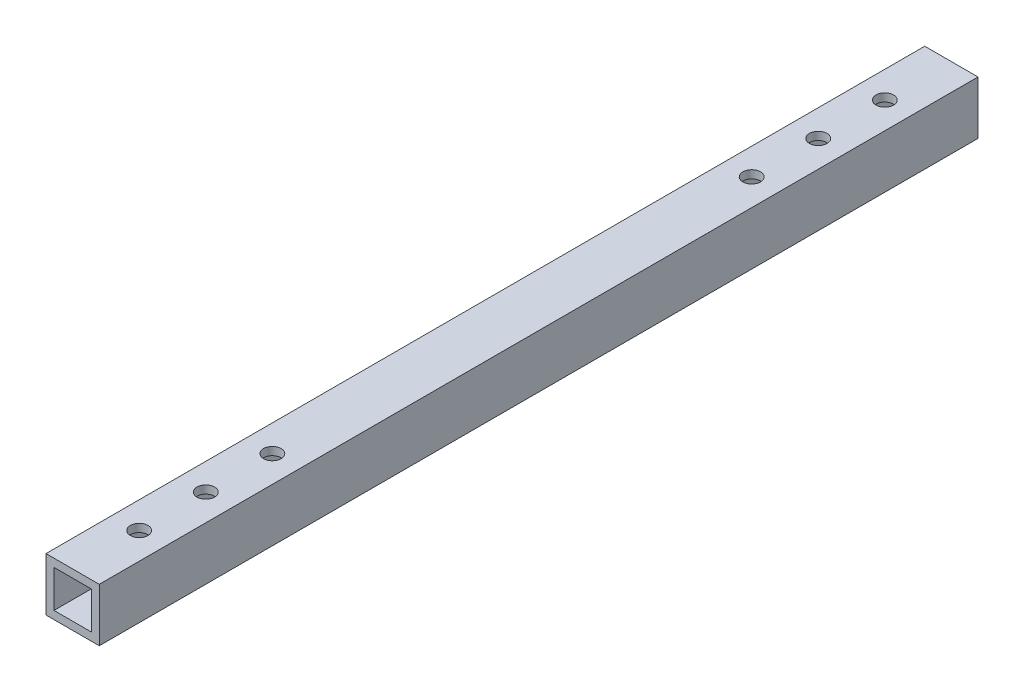
ISO-10303-21;
HEADER;
FILE_DESCRIPTION(('STEP AP214'),'2;1');
FILE_NAME('part.step','',(''),(''),'','','');
FILE_SCHEMA(('AUTOMOTIVE_DESIGN { 1 0 10303 214 1 1 1 1 }'));
ENDSEC;
DATA;
#1=APPLICATION_CONTEXT('core data for automotive mechanical design processes');
#2=APPLICATION_PROTOCOL_DEFINITION('international standard','automotive_design',2000,#1);
#3=PRODUCT_CONTEXT('',#1,'mechanical');
#4=PRODUCT('Part','Part','',(#3));
#5=PRODUCT_RELATED_PRODUCT_CATEGORY('part','',(#4));
#6=PRODUCT_DEFINITION_FORMATION('','',#4);
#7=PRODUCT_DEFINITION_CONTEXT('part definition',#1,'design');
#8=PRODUCT_DEFINITION('design','',#6,#7);
#9=PRODUCT_DEFINITION_SHAPE('','',#8);
#10=(LENGTH_UNIT() NAMED_UNIT(*) SI_UNIT(.MILLI.,.METRE.));
#11=(NAMED_UNIT(*) PLANE_ANGLE_UNIT() SI_UNIT($,.RADIAN.));
#12=(NAMED_UNIT(*) SI_UNIT($,.STERADIAN.) SOLID_ANGLE_UNIT());
#13=UNCERTAINTY_MEASURE_WITH_UNIT(LENGTH_MEASURE(1.E-05),#10,'distance_accuracy_value','');
#14=(GEOMETRIC_REPRESENTATION_CONTEXT(3) GLOBAL_UNCERTAINTY_ASSIGNED_CONTEXT((#13)) GLOBAL_UNIT_ASSIGNED_CONTEXT((#10,
#11,#12)) REPRESENTATION_CONTEXT('',''));
#15=CARTESIAN_POINT('',(0.,0.,0.));
#16=DIRECTION('',(0.,0.,1.));
#17=DIRECTION('',(1.,0.,0.));
#18=AXIS2_PLACEMENT_3D('',#15,#16,#17);
#19=CARTESIAN_POINT('',(0.,0.,165.));
#20=DIRECTION('',(0.,0.,1.));
#21=DIRECTION('',(1.,0.,0.));
#22=AXIS2_PLACEMENT_3D('',#19,#20,#21);
#23=PLANE('',#22);
#24=DIRECTION('',(0.,1.,0.));
#25=VECTOR('',#24,1.);
#26=CARTESIAN_POINT('',(5.,5.,165.));
#27=LINE('',#26,#25);
#28=CARTESIAN_POINT('',(5.,-5.,165.));
#29=VERTEX_POINT('',#28);
#30=CARTESIAN_POINT('',(5.,5.,165.));
#31=VERTEX_POINT('',#30);
#32=EDGE_CURVE('E140',#29,#31,#27,.T.);
#33=ORIENTED_EDGE('',*,*,#32,.T.);
#34=DIRECTION('',(-1.,0.,0.));
#35=VECTOR('',#34,1.);
#36=CARTESIAN_POINT('',(-5.,5.,165.));
#37=LINE('',#36,#35);
#38=CARTESIAN_POINT('',(-5.,5.,165.));
#39=VERTEX_POINT('',#38);
#40=EDGE_CURVE('E143',#31,#39,#37,.T.);
#41=ORIENTED_EDGE('',*,*,#40,.T.);
#42=DIRECTION('',(0.,-1.,0.));
#43=VECTOR('',#42,1.);
#44=CARTESIAN_POINT('',(-5.,5.,165.));
#45=LINE('',#44,#43);
#46=CARTESIAN_POINT('',(-5.,-5.,165.));
#47=VERTEX_POINT('',#46);
#48=EDGE_CURVE('E146',#39,#47,#45,.T.);
#49=ORIENTED_EDGE('',*,*,#48,.T.);
#50=DIRECTION('',(1.,0.,0.));
#51=VECTOR('',#50,1.);
#52=CARTESIAN_POINT('',(-5.,-5.,165.));
#53=LINE('',#52,#51);
#54=EDGE_CURVE('E148',#47,#29,#53,.T.);
#55=ORIENTED_EDGE('',*,*,#54,.T.);
#56=EDGE_LOOP('',(#33,#41,#49,#55));
#57=FACE_BOUND('',#56,.T.);
#58=DIRECTION('',(-1.,0.,0.));
#59=VECTOR('',#58,1.);
#60=CARTESIAN_POINT('',(-3.5,3.5,165.));
#61=LINE('',#60,#59);
#62=CARTESIAN_POINT('',(3.5,3.5,165.));
#63=VERTEX_POINT('',#62);
#64=CARTESIAN_POINT('',(-3.5,3.5,165.));
#65=VERTEX_POINT('',#64);
#66=EDGE_CURVE('E110',#63,#65,#61,.T.);
#67=ORIENTED_EDGE('',*,*,#66,.F.);
#68=DIRECTION('',(0.,1.,0.));
#69=VECTOR('',#68,1.);
#70=CARTESIAN_POINT('',(3.5,3.5,165.));
#71=LINE('',#70,#69);
#72=CARTESIAN_POINT('',(3.5,-3.5,165.));
#73=VERTEX_POINT('',#72);
#74=EDGE_CURVE('E102',#73,#63,#71,.T.);
#75=ORIENTED_EDGE('',*,*,#74,.F.);
#76=DIRECTION('',(1.,0.,0.));
#77=VECTOR('',#76,1.);
#78=CARTESIAN_POINT('',(-3.5,-3.5,165.));
#79=LINE('',#78,#77);
#80=CARTESIAN_POINT('',(-3.5,-3.5,165.));
#81=VERTEX_POINT('',#80);
#82=EDGE_CURVE('E124',#81,#73,#79,.T.);
#83=ORIENTED_EDGE('',*,*,#82,.F.);
#84=DIRECTION('',(0.,-1.,0.));
#85=VECTOR('',#84,1.);
#86=CARTESIAN_POINT('',(-3.5,3.5,165.));
#87=LINE('',#86,#85);
#88=EDGE_CURVE('E122',#65,#81,#87,.T.);
#89=ORIENTED_EDGE('',*,*,#88,.F.);
#90=EDGE_LOOP('',(#67,#75,#83,#89));
#91=FACE_BOUND('',#90,.T.);
#92=ADVANCED_FACE('F35',(#57,#91),#23,.T.);
#93=CARTESIAN_POINT('',(0.,0.,0.));
#94=DIRECTION('',(0.,0.,1.));
#95=DIRECTION('',(1.,0.,0.));
#96=AXIS2_PLACEMENT_3D('',#93,#94,#95);
#97=PLANE('',#96);
#98=DIRECTION('',(0.,1.,0.));
#99=VECTOR('',#98,1.);
#100=CARTESIAN_POINT('',(5.,5.,0.));
#101=LINE('',#100,#99);
#102=CARTESIAN_POINT('',(5.,-5.,0.));
#103=VERTEX_POINT('',#102);
#104=CARTESIAN_POINT('',(5.,5.,0.));
#105=VERTEX_POINT('',#104);
#106=EDGE_CURVE('E118',#103,#105,#101,.T.);
#107=ORIENTED_EDGE('',*,*,#106,.F.);
#108=DIRECTION('',(1.,0.,0.));
#109=VECTOR('',#108,1.);
#110=CARTESIAN_POINT('',(-5.,-5.,0.));
#111=LINE('',#110,#109);
#112=CARTESIAN_POINT('',(-5.,-5.,0.));
#113=VERTEX_POINT('',#112);
#114=EDGE_CURVE('E144',#113,#103,#111,.T.);
#115=ORIENTED_EDGE('',*,*,#114,.F.);
#116=DIRECTION('',(0.,-1.,0.));
#117=VECTOR('',#116,1.);
#118=CARTESIAN_POINT('',(-5.,5.,0.));
#119=LINE('',#118,#117);
#120=CARTESIAN_POINT('',(-5.,5.,0.));
#121=VERTEX_POINT('',#120);
#122=EDGE_CURVE('E155',#121,#113,#119,.T.);
#123=ORIENTED_EDGE('',*,*,#122,.F.);
#124=DIRECTION('',(-1.,0.,0.));
#125=VECTOR('',#124,1.);
#126=CARTESIAN_POINT('',(-5.,5.,0.));
#127=LINE('',#126,#125);
#128=EDGE_CURVE('E153',#105,#121,#127,.T.);
#129=ORIENTED_EDGE('',*,*,#128,.F.);
#130=EDGE_LOOP('',(#107,#115,#123,#129));
#131=FACE_BOUND('',#130,.T.);
#132=DIRECTION('',(0.,1.,0.));
#133=VECTOR('',#132,1.);
#134=CARTESIAN_POINT('',(3.5,3.5,0.));
#135=LINE('',#134,#133);
#136=CARTESIAN_POINT('',(3.5,-3.5,0.));
#137=VERTEX_POINT('',#136);
#138=CARTESIAN_POINT('',(3.5,3.5,0.));
#139=VERTEX_POINT('',#138);
#140=EDGE_CURVE('E60',#137,#139,#135,.T.);
#141=ORIENTED_EDGE('',*,*,#140,.T.);
#142=DIRECTION('',(-1.,0.,0.));
#143=VECTOR('',#142,1.);
#144=CARTESIAN_POINT('',(-3.5,3.5,0.));
#145=LINE('',#144,#143);
#146=CARTESIAN_POINT('',(-3.5,3.5,0.));
#147=VERTEX_POINT('',#146);
#148=EDGE_CURVE('E117',#139,#147,#145,.T.);
#149=ORIENTED_EDGE('',*,*,#148,.T.);
#150=DIRECTION('',(0.,-1.,0.));
#151=VECTOR('',#150,1.);
#152=CARTESIAN_POINT('',(-3.5,3.5,0.));
#153=LINE('',#152,#151);
#154=CARTESIAN_POINT('',(-3.5,-3.5,0.));
#155=VERTEX_POINT('',#154);
#156=EDGE_CURVE('E132',#147,#155,#153,.T.);
#157=ORIENTED_EDGE('',*,*,#156,.T.);
#158=DIRECTION('',(1.,0.,0.));
#159=VECTOR('',#158,1.);
#160=CARTESIAN_POINT('',(-3.5,-3.5,0.));
#161=LINE('',#160,#159);
#162=EDGE_CURVE('E111',#155,#137,#161,.T.);
#163=ORIENTED_EDGE('',*,*,#162,.T.);
#164=EDGE_LOOP('',(#141,#149,#157,#163));
#165=FACE_BOUND('',#164,.T.);
#166=ADVANCED_FACE('F219',(#131,#165),#97,.F.);
#167=CARTESIAN_POINT('',(5.,5.,165.));
#168=DIRECTION('',(-1.,0.,0.));
#169=DIRECTION('',(0.,0.,1.));
#170=AXIS2_PLACEMENT_3D('',#167,#168,#169);
#171=PLANE('',#170);
#172=ORIENTED_EDGE('',*,*,#106,.T.);
#173=DIRECTION('',(0.,0.,-1.));
#174=VECTOR('',#173,1.);
#175=CARTESIAN_POINT('',(5.,5.,165.));
#176=LINE('',#175,#174);
#177=EDGE_CURVE('E11',#31,#105,#176,.T.);
#178=ORIENTED_EDGE('',*,*,#177,.F.);
#179=ORIENTED_EDGE('',*,*,#32,.F.);
#180=DIRECTION('',(0.,0.,-1.));
#181=VECTOR('',#180,1.);
#182=CARTESIAN_POINT('',(5.,-5.,165.));
#183=LINE('',#182,#181);
#184=EDGE_CURVE('E150',#29,#103,#183,.T.);
#185=ORIENTED_EDGE('',*,*,#184,.T.);
#186=EDGE_LOOP('',(#172,#178,#179,#185));
#187=FACE_BOUND('',#186,.T.);
#188=ADVANCED_FACE('F37',(#187),#171,.F.);
#189=CARTESIAN_POINT('',(-5.,5.,165.));
#190=DIRECTION('',(0.,-1.,0.));
#191=DIRECTION('',(0.,0.,-1.));
#192=AXIS2_PLACEMENT_3D('',#189,#190,#191);
#193=PLANE('',#192);
#194=CARTESIAN_POINT('',(4.12777451108681E-12,5.,12.5000000000034));
#195=DIRECTION('',(0.,1.,0.));
#196=DIRECTION('',(0.,0.,1.));
#197=AXIS2_PLACEMENT_3D('',#194,#195,#196);
#198=CIRCLE('',#197,1.64999999999733);
#199=CARTESIAN_POINT('',(4.12777451108681E-12,5.,14.1500000000007));
#200=VERTEX_POINT('',#199);
#201=EDGE_CURVE('E255',#200,#200,#198,.T.);
#202=ORIENTED_EDGE('',*,*,#201,.F.);
#203=EDGE_LOOP('',(#202));
#204=FACE_BOUND('',#203,.T.);
#205=CARTESIAN_POINT('',(4.12257034065888E-12,5.,25.0000000000034));
#206=DIRECTION('',(0.,1.,0.));
#207=DIRECTION('',(0.,0.,1.));
#208=AXIS2_PLACEMENT_3D('',#205,#206,#207);
#209=CIRCLE('',#208,1.64999999999731);
#210=CARTESIAN_POINT('',(4.12257034065888E-12,5.,26.6500000000007));
#211=VERTEX_POINT('',#210);
#212=EDGE_CURVE('E259',#211,#211,#209,.T.);
#213=ORIENTED_EDGE('',*,*,#212,.F.);
#214=EDGE_LOOP('',(#213));
#215=FACE_BOUND('',#214,.T.);
#216=CARTESIAN_POINT('',(4.12690714934882E-12,5.,37.5000000000034));
#217=DIRECTION('',(0.,1.,0.));
#218=DIRECTION('',(0.,0.,1.));
#219=AXIS2_PLACEMENT_3D('',#216,#217,#218);
#220=CIRCLE('',#219,1.64999999999729);
#221=CARTESIAN_POINT('',(4.12690714934882E-12,5.,39.1500000000007));
#222=VERTEX_POINT('',#221);
#223=EDGE_CURVE('E263',#222,#222,#220,.T.);
#224=ORIENTED_EDGE('',*,*,#223,.F.);
#225=EDGE_LOOP('',(#224));
#226=FACE_BOUND('',#225,.T.);
#227=CARTESIAN_POINT('',(-1.03909936211011E-12,5.,127.5));
#228=DIRECTION('',(0.,1.,0.));
#229=DIRECTION('',(0.,0.,1.));
#230=AXIS2_PLACEMENT_3D('',#227,#228,#229);
#231=CIRCLE('',#230,1.65000000000149);
#232=CARTESIAN_POINT('',(-1.03909936211011E-12,5.,129.150000000001));
#233=VERTEX_POINT('',#232);
#234=EDGE_CURVE('E267',#233,#233,#231,.T.);
#235=ORIENTED_EDGE('',*,*,#234,.F.);
#236=EDGE_LOOP('',(#235));
#237=FACE_BOUND('',#236,.T.);
#238=CARTESIAN_POINT('',(-1.04603825601401E-12,5.,140.));
#239=DIRECTION('',(0.,1.,0.));
#240=DIRECTION('',(0.,0.,1.));
#241=AXIS2_PLACEMENT_3D('',#238,#239,#240);
#242=CIRCLE('',#241,1.65000000000145);
#243=CARTESIAN_POINT('',(-1.04603825601401E-12,5.,141.650000000001));
#244=VERTEX_POINT('',#243);
#245=EDGE_CURVE('E271',#244,#244,#242,.T.);
#246=ORIENTED_EDGE('',*,*,#245,.F.);
#247=EDGE_LOOP('',(#246));
#248=FACE_BOUND('',#247,.T.);
#249=CARTESIAN_POINT('',(-1.05297714991792E-12,5.,152.5));
#250=DIRECTION('',(0.,1.,0.));
#251=DIRECTION('',(0.,0.,1.));
#252=AXIS2_PLACEMENT_3D('',#249,#250,#251);
#253=CIRCLE('',#252,1.6500000000015);
#254=CARTESIAN_POINT('',(-1.05297714991792E-12,5.,154.150000000001));
#255=VERTEX_POINT('',#254);
#256=EDGE_CURVE('E275',#255,#255,#253,.T.);
#257=ORIENTED_EDGE('',*,*,#256,.F.);
#258=EDGE_LOOP('',(#257));
#259=FACE_BOUND('',#258,.T.);
#260=ORIENTED_EDGE('',*,*,#128,.T.);
#261=DIRECTION('',(0.,0.,-1.));
#262=VECTOR('',#261,1.);
#263=CARTESIAN_POINT('',(-5.,5.,165.));
#264=LINE('',#263,#262);
#265=EDGE_CURVE('E44',#39,#121,#264,.T.);
#266=ORIENTED_EDGE('',*,*,#265,.F.);
#267=ORIENTED_EDGE('',*,*,#40,.F.);
#268=ORIENTED_EDGE('',*,*,#177,.T.);
#269=EDGE_LOOP('',(#260,#266,#267,#268));
#270=FACE_BOUND('',#269,.T.);
#271=ADVANCED_FACE('F244',(#204,#215,#226,#237,#248,#259,#270),#193,.F.);
#272=CARTESIAN_POINT('',(-5.,5.,165.));
#273=DIRECTION('',(1.,0.,0.));
#274=DIRECTION('',(0.,0.,-1.));
#275=AXIS2_PLACEMENT_3D('',#272,#273,#274);
#276=PLANE('',#275);
#277=ORIENTED_EDGE('',*,*,#122,.T.);
#278=DIRECTION('',(0.,0.,-1.));
#279=VECTOR('',#278,1.);
#280=CARTESIAN_POINT('',(-5.,-5.,165.));
#281=LINE('',#280,#279);
#282=EDGE_CURVE('E160',#47,#113,#281,.T.);
#283=ORIENTED_EDGE('',*,*,#282,.F.);
#284=ORIENTED_EDGE('',*,*,#48,.F.);
#285=ORIENTED_EDGE('',*,*,#265,.T.);
#286=EDGE_LOOP('',(#277,#283,#284,#285));
#287=FACE_BOUND('',#286,.T.);
#288=ADVANCED_FACE('F241',(#287),#276,.F.);
#289=CARTESIAN_POINT('',(-5.,-5.,165.));
#290=DIRECTION('',(0.,1.,0.));
#291=DIRECTION('',(0.,0.,1.));
#292=AXIS2_PLACEMENT_3D('',#289,#290,#291);
#293=PLANE('',#292);
#294=CARTESIAN_POINT('',(4.12777451108681E-12,-5.,12.5000000000034));
#295=DIRECTION('',(0.,1.,0.));
#296=DIRECTION('',(0.,0.,1.));
#297=AXIS2_PLACEMENT_3D('',#294,#295,#296);
#298=CIRCLE('',#297,1.64999999999733);
#299=CARTESIAN_POINT('',(4.12777451108681E-12,-5.,14.1500000000007));
#300=VERTEX_POINT('',#299);
#301=EDGE_CURVE('E169',#300,#300,#298,.T.);
#302=ORIENTED_EDGE('',*,*,#301,.T.);
#303=EDGE_LOOP('',(#302));
#304=FACE_BOUND('',#303,.T.);
#305=CARTESIAN_POINT('',(4.12257034065888E-12,-5.,25.0000000000034));
#306=DIRECTION('',(0.,1.,0.));
#307=DIRECTION('',(0.,0.,1.));
#308=AXIS2_PLACEMENT_3D('',#305,#306,#307);
#309=CIRCLE('',#308,1.64999999999731);
#310=CARTESIAN_POINT('',(4.12257034065888E-12,-5.,26.6500000000007));
#311=VERTEX_POINT('',#310);
#312=EDGE_CURVE('E352',#311,#311,#309,.T.);
#313=ORIENTED_EDGE('',*,*,#312,.T.);
#314=EDGE_LOOP('',(#313));
#315=FACE_BOUND('',#314,.T.);
#316=CARTESIAN_POINT('',(4.12690714934882E-12,-5.,37.5000000000034));
#317=DIRECTION('',(0.,1.,0.));
#318=DIRECTION('',(0.,0.,1.));
#319=AXIS2_PLACEMENT_3D('',#316,#317,#318);
#320=CIRCLE('',#319,1.64999999999729);
#321=CARTESIAN_POINT('',(4.12690714934882E-12,-5.,39.1500000000007));
#322=VERTEX_POINT('',#321);
#323=EDGE_CURVE('E353',#322,#322,#320,.T.);
#324=ORIENTED_EDGE('',*,*,#323,.T.);
#325=EDGE_LOOP('',(#324));
#326=FACE_BOUND('',#325,.T.);
#327=CARTESIAN_POINT('',(-1.03909936211011E-12,-5.,127.5));
#328=DIRECTION('',(0.,1.,0.));
#329=DIRECTION('',(0.,0.,1.));
#330=AXIS2_PLACEMENT_3D('',#327,#328,#329);
#331=CIRCLE('',#330,1.65000000000149);
#332=CARTESIAN_POINT('',(-1.03909936211011E-12,-5.,129.150000000001));
#333=VERTEX_POINT('',#332);
#334=EDGE_CURVE('E362',#333,#333,#331,.T.);
#335=ORIENTED_EDGE('',*,*,#334,.T.);
#336=EDGE_LOOP('',(#335));
#337=FACE_BOUND('',#336,.T.);
#338=CARTESIAN_POINT('',(-1.04603825601401E-12,-5.,140.));
#339=DIRECTION('',(0.,1.,0.));
#340=DIRECTION('',(0.,0.,1.));
#341=AXIS2_PLACEMENT_3D('',#338,#339,#340);
#342=CIRCLE('',#341,1.65000000000145);
#343=CARTESIAN_POINT('',(-1.04603825601401E-12,-5.,141.650000000001));
#344=VERTEX_POINT('',#343);
#345=EDGE_CURVE('E366',#344,#344,#342,.T.);
#346=ORIENTED_EDGE('',*,*,#345,.T.);
#347=EDGE_LOOP('',(#346));
#348=FACE_BOUND('',#347,.T.);
#349=CARTESIAN_POINT('',(-1.05297714991792E-12,-5.,152.5));
#350=DIRECTION('',(0.,1.,0.));
#351=DIRECTION('',(0.,0.,1.));
#352=AXIS2_PLACEMENT_3D('',#349,#350,#351);
#353=CIRCLE('',#352,1.6500000000015);
#354=CARTESIAN_POINT('',(-1.05297714991792E-12,-5.,154.150000000001));
#355=VERTEX_POINT('',#354);
#356=EDGE_CURVE('E288',#355,#355,#353,.T.);
#357=ORIENTED_EDGE('',*,*,#356,.T.);
#358=EDGE_LOOP('',(#357));
#359=FACE_BOUND('',#358,.T.);
#360=ORIENTED_EDGE('',*,*,#114,.T.);
#361=ORIENTED_EDGE('',*,*,#184,.F.);
#362=ORIENTED_EDGE('',*,*,#54,.F.);
#363=ORIENTED_EDGE('',*,*,#282,.T.);
#364=EDGE_LOOP('',(#360,#361,#362,#363));
#365=FACE_BOUND('',#364,.T.);
#366=ADVANCED_FACE('F238',(#304,#315,#326,#337,#348,#359,#365),#293,.F.);
#367=CARTESIAN_POINT('',(3.5,3.5,165.));
#368=DIRECTION('',(-1.,0.,0.));
#369=DIRECTION('',(0.,0.,1.));
#370=AXIS2_PLACEMENT_3D('',#367,#368,#369);
#371=PLANE('',#370);
#372=ORIENTED_EDGE('',*,*,#140,.F.);
#373=DIRECTION('',(0.,0.,-1.));
#374=VECTOR('',#373,1.);
#375=CARTESIAN_POINT('',(3.5,-3.5,165.));
#376=LINE('',#375,#374);
#377=EDGE_CURVE('E106',#73,#137,#376,.T.);
#378=ORIENTED_EDGE('',*,*,#377,.F.);
#379=ORIENTED_EDGE('',*,*,#74,.T.);
#380=DIRECTION('',(0.,0.,-1.));
#381=VECTOR('',#380,1.);
#382=CARTESIAN_POINT('',(3.5,3.5,165.));
#383=LINE('',#382,#381);
#384=EDGE_CURVE('E105',#63,#139,#383,.T.);
#385=ORIENTED_EDGE('',*,*,#384,.T.);
#386=EDGE_LOOP('',(#372,#378,#379,#385));
#387=FACE_BOUND('',#386,.T.);
#388=ADVANCED_FACE('F104',(#387),#371,.T.);
#389=CARTESIAN_POINT('',(-3.5,3.5,165.));
#390=DIRECTION('',(0.,-1.,0.));
#391=DIRECTION('',(0.,0.,-1.));
#392=AXIS2_PLACEMENT_3D('',#389,#390,#391);
#393=PLANE('',#392);
#394=CARTESIAN_POINT('',(4.12777451108681E-12,3.5,12.5000000000034));
#395=DIRECTION('',(0.,-1.,0.));
#396=DIRECTION('',(0.,0.,-1.));
#397=AXIS2_PLACEMENT_3D('',#394,#395,#396);
#398=CIRCLE('',#397,1.64999999999733);
#399=CARTESIAN_POINT('',(4.12777451108681E-12,3.5,10.850000000006));
#400=VERTEX_POINT('',#399);
#401=EDGE_CURVE('E130',#400,#400,#398,.T.);
#402=ORIENTED_EDGE('',*,*,#401,.F.);
#403=EDGE_LOOP('',(#402));
#404=FACE_BOUND('',#403,.T.);
#405=CARTESIAN_POINT('',(4.12257034065888E-12,3.5,25.0000000000034));
#406=DIRECTION('',(0.,-1.,0.));
#407=DIRECTION('',(0.,0.,-1.));
#408=AXIS2_PLACEMENT_3D('',#405,#406,#407);
#409=CIRCLE('',#408,1.64999999999731);
#410=CARTESIAN_POINT('',(4.12257034065888E-12,3.5,23.3500000000061));
#411=VERTEX_POINT('',#410);
#412=EDGE_CURVE('E183',#411,#411,#409,.T.);
#413=ORIENTED_EDGE('',*,*,#412,.F.);
#414=EDGE_LOOP('',(#413));
#415=FACE_BOUND('',#414,.T.);
#416=CARTESIAN_POINT('',(4.12690714934882E-12,3.5,37.5000000000034));
#417=DIRECTION('',(0.,-1.,0.));
#418=DIRECTION('',(0.,0.,-1.));
#419=AXIS2_PLACEMENT_3D('',#416,#417,#418);
#420=CIRCLE('',#419,1.64999999999729);
#421=CARTESIAN_POINT('',(4.12690714934882E-12,3.5,35.8500000000061));
#422=VERTEX_POINT('',#421);
#423=EDGE_CURVE('E180',#422,#422,#420,.T.);
#424=ORIENTED_EDGE('',*,*,#423,.F.);
#425=EDGE_LOOP('',(#424));
#426=FACE_BOUND('',#425,.T.);
#427=CARTESIAN_POINT('',(-1.03909936211011E-12,3.5,127.5));
#428=DIRECTION('',(0.,-1.,0.));
#429=DIRECTION('',(0.,0.,-1.));
#430=AXIS2_PLACEMENT_3D('',#427,#428,#429);
#431=CIRCLE('',#430,1.65000000000149);
#432=CARTESIAN_POINT('',(-1.03909936211011E-12,3.5,125.849999999998));
#433=VERTEX_POINT('',#432);
#434=EDGE_CURVE('E177',#433,#433,#431,.T.);
#435=ORIENTED_EDGE('',*,*,#434,.F.);
#436=EDGE_LOOP('',(#435));
#437=FACE_BOUND('',#436,.T.);
#438=CARTESIAN_POINT('',(-1.04603825601401E-12,3.5,140.));
#439=DIRECTION('',(0.,-1.,0.));
#440=DIRECTION('',(0.,0.,-1.));
#441=AXIS2_PLACEMENT_3D('',#438,#439,#440);
#442=CIRCLE('',#441,1.65000000000145);
#443=CARTESIAN_POINT('',(-1.04603825601401E-12,3.5,138.349999999998));
#444=VERTEX_POINT('',#443);
#445=EDGE_CURVE('E173',#444,#444,#442,.T.);
#446=ORIENTED_EDGE('',*,*,#445,.F.);
#447=EDGE_LOOP('',(#446));
#448=FACE_BOUND('',#447,.T.);
#449=CARTESIAN_POINT('',(-1.05297714991792E-12,3.5,152.5));
#450=DIRECTION('',(0.,-1.,0.));
#451=DIRECTION('',(0.,0.,-1.));
#452=AXIS2_PLACEMENT_3D('',#449,#450,#451);
#453=CIRCLE('',#452,1.6500000000015);
#454=CARTESIAN_POINT('',(-1.05297714991792E-12,3.5,150.849999999998));
#455=VERTEX_POINT('',#454);
#456=EDGE_CURVE('E168',#455,#455,#453,.T.);
#457=ORIENTED_EDGE('',*,*,#456,.F.);
#458=EDGE_LOOP('',(#457));
#459=FACE_BOUND('',#458,.T.);
#460=ORIENTED_EDGE('',*,*,#148,.F.);
#461=ORIENTED_EDGE('',*,*,#384,.F.);
#462=ORIENTED_EDGE('',*,*,#66,.T.);
#463=DIRECTION('',(0.,0.,-1.));
#464=VECTOR('',#463,1.);
#465=CARTESIAN_POINT('',(-3.5,3.5,165.));
#466=LINE('',#465,#464);
#467=EDGE_CURVE('E119',#65,#147,#466,.T.);
#468=ORIENTED_EDGE('',*,*,#467,.T.);
#469=EDGE_LOOP('',(#460,#461,#462,#468));
#470=FACE_BOUND('',#469,.T.);
#471=ADVANCED_FACE('F114',(#404,#415,#426,#437,#448,#459,#470),#393,.T.);
#472=CARTESIAN_POINT('',(-3.5,3.5,165.));
#473=DIRECTION('',(1.,0.,0.));
#474=DIRECTION('',(0.,0.,-1.));
#475=AXIS2_PLACEMENT_3D('',#472,#473,#474);
#476=PLANE('',#475);
#477=ORIENTED_EDGE('',*,*,#156,.F.);
#478=ORIENTED_EDGE('',*,*,#467,.F.);
#479=ORIENTED_EDGE('',*,*,#88,.T.);
#480=DIRECTION('',(0.,0.,-1.));
#481=VECTOR('',#480,1.);
#482=CARTESIAN_POINT('',(-3.5,-3.5,165.));
#483=LINE('',#482,#481);
#484=EDGE_CURVE('E52',#81,#155,#483,.T.);
#485=ORIENTED_EDGE('',*,*,#484,.T.);
#486=EDGE_LOOP('',(#477,#478,#479,#485));
#487=FACE_BOUND('',#486,.T.);
#488=ADVANCED_FACE('F207',(#487),#476,.T.);
#489=CARTESIAN_POINT('',(-3.5,-3.5,165.));
#490=DIRECTION('',(0.,1.,0.));
#491=DIRECTION('',(0.,0.,1.));
#492=AXIS2_PLACEMENT_3D('',#489,#490,#491);
#493=PLANE('',#492);
#494=CARTESIAN_POINT('',(4.12777451108681E-12,-3.5,12.5000000000034));
#495=DIRECTION('',(0.,1.,0.));
#496=DIRECTION('',(0.,0.,1.));
#497=AXIS2_PLACEMENT_3D('',#494,#495,#496);
#498=CIRCLE('',#497,1.64999999999733);
#499=CARTESIAN_POINT('',(4.12777451108681E-12,-3.5,14.1500000000007));
#500=VERTEX_POINT('',#499);
#501=EDGE_CURVE('E39',#500,#500,#498,.T.);
#502=ORIENTED_EDGE('',*,*,#501,.F.);
#503=EDGE_LOOP('',(#502));
#504=FACE_BOUND('',#503,.T.);
#505=CARTESIAN_POINT('',(4.12257034065888E-12,-3.5,25.0000000000034));
#506=DIRECTION('',(0.,1.,0.));
#507=DIRECTION('',(0.,0.,1.));
#508=AXIS2_PLACEMENT_3D('',#505,#506,#507);
#509=CIRCLE('',#508,1.64999999999731);
#510=CARTESIAN_POINT('',(4.12257034065888E-12,-3.5,26.6500000000007));
#511=VERTEX_POINT('',#510);
#512=EDGE_CURVE('E181',#511,#511,#509,.T.);
#513=ORIENTED_EDGE('',*,*,#512,.F.);
#514=EDGE_LOOP('',(#513));
#515=FACE_BOUND('',#514,.T.);
#516=CARTESIAN_POINT('',(4.12690714934882E-12,-3.5,37.5000000000034));
#517=DIRECTION('',(0.,1.,0.));
#518=DIRECTION('',(0.,0.,1.));
#519=AXIS2_PLACEMENT_3D('',#516,#517,#518);
#520=CIRCLE('',#519,1.64999999999729);
#521=CARTESIAN_POINT('',(4.12690714934882E-12,-3.5,39.1500000000007));
#522=VERTEX_POINT('',#521);
#523=EDGE_CURVE('E178',#522,#522,#520,.T.);
#524=ORIENTED_EDGE('',*,*,#523,.F.);
#525=EDGE_LOOP('',(#524));
#526=FACE_BOUND('',#525,.T.);
#527=CARTESIAN_POINT('',(-1.03909936211011E-12,-3.5,127.5));
#528=DIRECTION('',(0.,1.,0.));
#529=DIRECTION('',(0.,0.,1.));
#530=AXIS2_PLACEMENT_3D('',#527,#528,#529);
#531=CIRCLE('',#530,1.65000000000149);
#532=CARTESIAN_POINT('',(-1.03909936211011E-12,-3.5,129.150000000001));
#533=VERTEX_POINT('',#532);
#534=EDGE_CURVE('E174',#533,#533,#531,.T.);
#535=ORIENTED_EDGE('',*,*,#534,.F.);
#536=EDGE_LOOP('',(#535));
#537=FACE_BOUND('',#536,.T.);
#538=CARTESIAN_POINT('',(-1.04603825601401E-12,-3.5,140.));
#539=DIRECTION('',(0.,1.,0.));
#540=DIRECTION('',(0.,0.,1.));
#541=AXIS2_PLACEMENT_3D('',#538,#539,#540);
#542=CIRCLE('',#541,1.65000000000145);
#543=CARTESIAN_POINT('',(-1.04603825601401E-12,-3.5,141.650000000001));
#544=VERTEX_POINT('',#543);
#545=EDGE_CURVE('E170',#544,#544,#542,.T.);
#546=ORIENTED_EDGE('',*,*,#545,.F.);
#547=EDGE_LOOP('',(#546));
#548=FACE_BOUND('',#547,.T.);
#549=CARTESIAN_POINT('',(-1.05297714991792E-12,-3.5,152.5));
#550=DIRECTION('',(0.,1.,0.));
#551=DIRECTION('',(0.,0.,1.));
#552=AXIS2_PLACEMENT_3D('',#549,#550,#551);
#553=CIRCLE('',#552,1.6500000000015);
#554=CARTESIAN_POINT('',(-1.05297714991792E-12,-3.5,154.150000000001));
#555=VERTEX_POINT('',#554);
#556=EDGE_CURVE('E165',#555,#555,#553,.T.);
#557=ORIENTED_EDGE('',*,*,#556,.F.);
#558=EDGE_LOOP('',(#557));
#559=FACE_BOUND('',#558,.T.);
#560=ORIENTED_EDGE('',*,*,#162,.F.);
#561=ORIENTED_EDGE('',*,*,#484,.F.);
#562=ORIENTED_EDGE('',*,*,#82,.T.);
#563=ORIENTED_EDGE('',*,*,#377,.T.);
#564=EDGE_LOOP('',(#560,#561,#562,#563));
#565=FACE_BOUND('',#564,.T.);
#566=ADVANCED_FACE('F203',(#504,#515,#526,#537,#548,#559,#565),#493,.T.);
#567=CARTESIAN_POINT('',(-1.05297714991792E-12,-5.,152.5));
#568=DIRECTION('',(0.,1.,0.));
#569=DIRECTION('',(0.,0.,1.));
#570=AXIS2_PLACEMENT_3D('',#567,#568,#569);
#571=CYLINDRICAL_SURFACE('',#570,1.6500000000015);
#572=ORIENTED_EDGE('',*,*,#556,.T.);
#573=EDGE_LOOP('',(#572));
#574=FACE_BOUND('',#573,.T.);
#575=ORIENTED_EDGE('',*,*,#356,.F.);
#576=EDGE_LOOP('',(#575));
#577=FACE_BOUND('',#576,.T.);
#578=ADVANCED_FACE('F206',(#574,#577),#571,.F.);
#579=CARTESIAN_POINT('',(-1.04603825601401E-12,-5.,140.));
#580=DIRECTION('',(0.,1.,0.));
#581=DIRECTION('',(0.,0.,1.));
#582=AXIS2_PLACEMENT_3D('',#579,#580,#581);
#583=CYLINDRICAL_SURFACE('',#582,1.65000000000145);
#584=ORIENTED_EDGE('',*,*,#545,.T.);
#585=EDGE_LOOP('',(#584));
#586=FACE_BOUND('',#585,.T.);
#587=ORIENTED_EDGE('',*,*,#345,.F.);
#588=EDGE_LOOP('',(#587));
#589=FACE_BOUND('',#588,.T.);
#590=ADVANCED_FACE('F313',(#586,#589),#583,.F.);
#591=CARTESIAN_POINT('',(-1.03909936211011E-12,-5.,127.5));
#592=DIRECTION('',(0.,1.,0.));
#593=DIRECTION('',(0.,0.,1.));
#594=AXIS2_PLACEMENT_3D('',#591,#592,#593);
#595=CYLINDRICAL_SURFACE('',#594,1.65000000000149);
#596=ORIENTED_EDGE('',*,*,#534,.T.);
#597=EDGE_LOOP('',(#596));
#598=FACE_BOUND('',#597,.T.);
#599=ORIENTED_EDGE('',*,*,#334,.F.);
#600=EDGE_LOOP('',(#599));
#601=FACE_BOUND('',#600,.T.);
#602=ADVANCED_FACE('F322',(#598,#601),#595,.F.);
#603=CARTESIAN_POINT('',(4.12690714934882E-12,-5.,37.5000000000034));
#604=DIRECTION('',(0.,1.,0.));
#605=DIRECTION('',(0.,0.,1.));
#606=AXIS2_PLACEMENT_3D('',#603,#604,#605);
#607=CYLINDRICAL_SURFACE('',#606,1.64999999999729);
#608=ORIENTED_EDGE('',*,*,#523,.T.);
#609=EDGE_LOOP('',(#608));
#610=FACE_BOUND('',#609,.T.);
#611=ORIENTED_EDGE('',*,*,#323,.F.);
#612=EDGE_LOOP('',(#611));
#613=FACE_BOUND('',#612,.T.);
#614=ADVANCED_FACE('F330',(#610,#613),#607,.F.);
#615=CARTESIAN_POINT('',(4.12257034065888E-12,-5.,25.0000000000034));
#616=DIRECTION('',(0.,1.,0.));
#617=DIRECTION('',(0.,0.,1.));
#618=AXIS2_PLACEMENT_3D('',#615,#616,#617);
#619=CYLINDRICAL_SURFACE('',#618,1.64999999999731);
#620=ORIENTED_EDGE('',*,*,#512,.T.);
#621=EDGE_LOOP('',(#620));
#622=FACE_BOUND('',#621,.T.);
#623=ORIENTED_EDGE('',*,*,#312,.F.);
#624=EDGE_LOOP('',(#623));
#625=FACE_BOUND('',#624,.T.);
#626=ADVANCED_FACE('F314',(#622,#625),#619,.F.);
#627=CARTESIAN_POINT('',(4.12777451108681E-12,-5.,12.5000000000034));
#628=DIRECTION('',(0.,1.,0.));
#629=DIRECTION('',(0.,0.,1.));
#630=AXIS2_PLACEMENT_3D('',#627,#628,#629);
#631=CYLINDRICAL_SURFACE('',#630,1.64999999999733);
#632=ORIENTED_EDGE('',*,*,#501,.T.);
#633=EDGE_LOOP('',(#632));
#634=FACE_BOUND('',#633,.T.);
#635=ORIENTED_EDGE('',*,*,#301,.F.);
#636=EDGE_LOOP('',(#635));
#637=FACE_BOUND('',#636,.T.);
#638=ADVANCED_FACE('F200',(#634,#637),#631,.F.);
#639=ORIENTED_EDGE('',*,*,#456,.T.);
#640=EDGE_LOOP('',(#639));
#641=FACE_BOUND('',#640,.T.);
#642=ORIENTED_EDGE('',*,*,#256,.T.);
#643=EDGE_LOOP('',(#642));
#644=FACE_BOUND('',#643,.T.);
#645=ADVANCED_FACE('F304',(#641,#644),#571,.F.);
#646=ORIENTED_EDGE('',*,*,#445,.T.);
#647=EDGE_LOOP('',(#646));
#648=FACE_BOUND('',#647,.T.);
#649=ORIENTED_EDGE('',*,*,#245,.T.);
#650=EDGE_LOOP('',(#649));
#651=FACE_BOUND('',#650,.T.);
#652=ADVANCED_FACE('F298',(#648,#651),#583,.F.);
#653=ORIENTED_EDGE('',*,*,#434,.T.);
#654=EDGE_LOOP('',(#653));
#655=FACE_BOUND('',#654,.T.);
#656=ORIENTED_EDGE('',*,*,#234,.T.);
#657=EDGE_LOOP('',(#656));
#658=FACE_BOUND('',#657,.T.);
#659=ADVANCED_FACE('F311',(#655,#658),#595,.F.);
#660=ORIENTED_EDGE('',*,*,#423,.T.);
#661=EDGE_LOOP('',(#660));
#662=FACE_BOUND('',#661,.T.);
#663=ORIENTED_EDGE('',*,*,#223,.T.);
#664=EDGE_LOOP('',(#663));
#665=FACE_BOUND('',#664,.T.);
#666=ADVANCED_FACE('F338',(#662,#665),#607,.F.);
#667=ORIENTED_EDGE('',*,*,#412,.T.);
#668=EDGE_LOOP('',(#667));
#669=FACE_BOUND('',#668,.T.);
#670=ORIENTED_EDGE('',*,*,#212,.T.);
#671=EDGE_LOOP('',(#670));
#672=FACE_BOUND('',#671,.T.);
#673=ADVANCED_FACE('F340',(#669,#672),#619,.F.);
#674=ORIENTED_EDGE('',*,*,#401,.T.);
#675=EDGE_LOOP('',(#674));
#676=FACE_BOUND('',#675,.T.);
#677=ORIENTED_EDGE('',*,*,#201,.T.);
#678=EDGE_LOOP('',(#677));
#679=FACE_BOUND('',#678,.T.);
#680=ADVANCED_FACE('F316',(#676,#679),#631,.F.);
#681=CLOSED_SHELL('',(#92,#166,#188,#271,#288,#366,#388,#471,#488,#566,#578,#590,#602,#614,#626,
#638,#645,#652,#659,#666,#673,#680));
#682=MANIFOLD_SOLID_BREP('B2',#681);
#683=ADVANCED_BREP_SHAPE_REPRESENTATION('',(#18,#682),#14);
#684=SHAPE_DEFINITION_REPRESENTATION(#9,#683);
ENDSEC;
END-ISO-10303-21;
